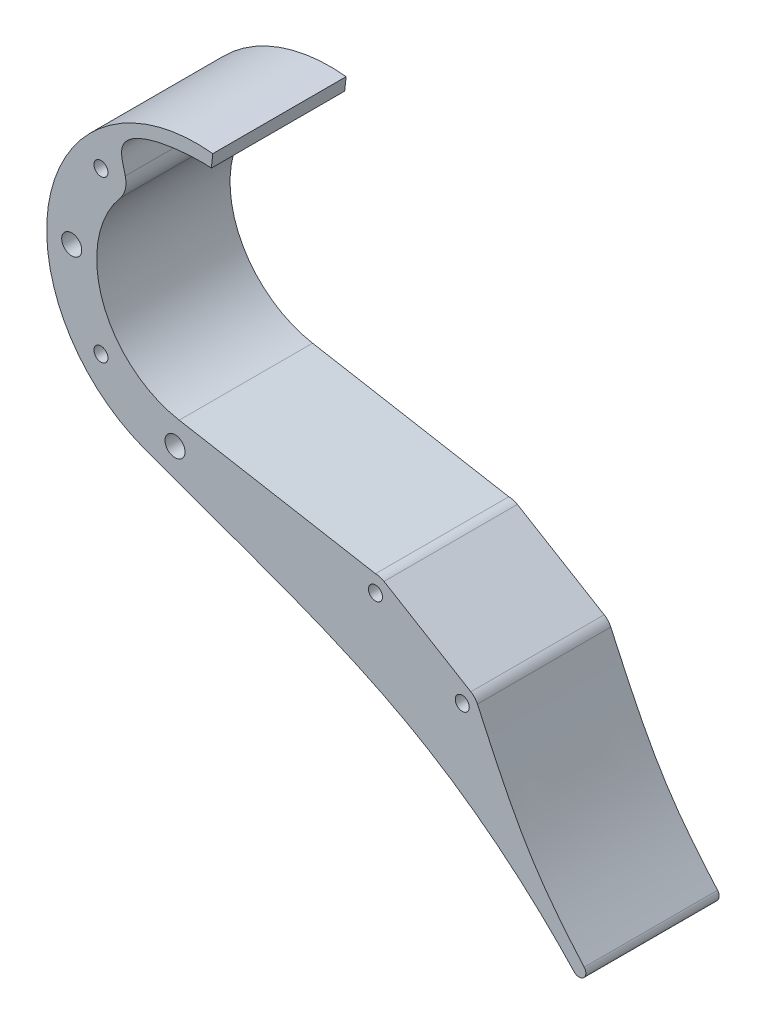
ISO-10303-21;
HEADER;
FILE_DESCRIPTION(('STEP AP214'),'2;1');
FILE_NAME('part.step','',(''),(''),'','','');
FILE_SCHEMA(('AUTOMOTIVE_DESIGN { 1 0 10303 214 1 1 1 1 }'));
ENDSEC;
DATA;
#1=APPLICATION_CONTEXT('core data for automotive mechanical design processes');
#2=APPLICATION_PROTOCOL_DEFINITION('international standard','automotive_design',2000,#1);
#3=PRODUCT_CONTEXT('',#1,'mechanical');
#4=PRODUCT('Part','Part','',(#3));
#5=PRODUCT_RELATED_PRODUCT_CATEGORY('part','',(#4));
#6=PRODUCT_DEFINITION_FORMATION('','',#4);
#7=PRODUCT_DEFINITION_CONTEXT('part definition',#1,'design');
#8=PRODUCT_DEFINITION('design','',#6,#7);
#9=PRODUCT_DEFINITION_SHAPE('','',#8);
#10=(LENGTH_UNIT() NAMED_UNIT(*) SI_UNIT(.MILLI.,.METRE.));
#11=(NAMED_UNIT(*) PLANE_ANGLE_UNIT() SI_UNIT($,.RADIAN.));
#12=(NAMED_UNIT(*) SI_UNIT($,.STERADIAN.) SOLID_ANGLE_UNIT());
#13=UNCERTAINTY_MEASURE_WITH_UNIT(LENGTH_MEASURE(1.E-05),#10,'distance_accuracy_value','');
#14=(GEOMETRIC_REPRESENTATION_CONTEXT(3) GLOBAL_UNCERTAINTY_ASSIGNED_CONTEXT((#13)) GLOBAL_UNIT_ASSIGNED_CONTEXT((#10,
#11,#12)) REPRESENTATION_CONTEXT('',''));
#15=CARTESIAN_POINT('',(0.,0.,0.));
#16=DIRECTION('',(0.,0.,1.));
#17=DIRECTION('',(1.,0.,0.));
#18=AXIS2_PLACEMENT_3D('',#15,#16,#17);
#19=CARTESIAN_POINT('',(-37.49999999528,3.60540814239372E-13,50.0000000000028));
#20=DIRECTION('',(0.,0.,-1.));
#21=DIRECTION('',(-1.,0.,0.));
#22=AXIS2_PLACEMENT_3D('',#19,#20,#21);
#23=CYLINDRICAL_SURFACE('',#22,1.7);
#24=CARTESIAN_POINT('',(-37.49999999528,3.60540814239372E-13,10.));
#25=DIRECTION('',(0.,0.,-1.));
#26=DIRECTION('',(-1.,0.,0.));
#27=AXIS2_PLACEMENT_3D('',#24,#25,#26);
#28=CIRCLE('',#27,1.7);
#29=CARTESIAN_POINT('',(-39.19999999528,3.60540814239372E-13,10.));
#30=VERTEX_POINT('',#29);
#31=EDGE_CURVE('E303',#30,#30,#28,.T.);
#32=ORIENTED_EDGE('',*,*,#31,.T.);
#33=EDGE_LOOP('',(#32));
#34=FACE_BOUND('',#33,.T.);
#35=CARTESIAN_POINT('',(-37.49999999528,3.60540814239372E-13,20.));
#36=DIRECTION('',(0.,0.,1.));
#37=DIRECTION('',(1.,0.,0.));
#38=AXIS2_PLACEMENT_3D('',#35,#36,#37);
#39=CIRCLE('',#38,1.7);
#40=CARTESIAN_POINT('',(-35.79999999528,3.60540814239372E-13,20.));
#41=VERTEX_POINT('',#40);
#42=EDGE_CURVE('E45',#41,#41,#39,.F.);
#43=ORIENTED_EDGE('',*,*,#42,.F.);
#44=EDGE_LOOP('',(#43));
#45=FACE_BOUND('',#44,.T.);
#46=ADVANCED_FACE('F41',(#34,#45),#23,.F.);
#47=CARTESIAN_POINT('',(-6.51180666250987,-36.9302907379578,50.0000000000028));
#48=DIRECTION('',(0.,0.,-1.));
#49=DIRECTION('',(-1.,0.,0.));
#50=AXIS2_PLACEMENT_3D('',#47,#48,#49);
#51=CYLINDRICAL_SURFACE('',#50,1.7);
#52=CARTESIAN_POINT('',(-6.51180666250987,-36.9302907379578,10.));
#53=DIRECTION('',(0.,0.,-1.));
#54=DIRECTION('',(-1.,0.,0.));
#55=AXIS2_PLACEMENT_3D('',#52,#53,#54);
#56=CIRCLE('',#55,1.7);
#57=CARTESIAN_POINT('',(-8.21180666250987,-36.9302907379578,10.));
#58=VERTEX_POINT('',#57);
#59=EDGE_CURVE('E300',#58,#58,#56,.T.);
#60=ORIENTED_EDGE('',*,*,#59,.T.);
#61=EDGE_LOOP('',(#60));
#62=FACE_BOUND('',#61,.T.);
#63=CARTESIAN_POINT('',(-6.51180666250987,-36.9302907379578,20.));
#64=DIRECTION('',(0.,0.,1.));
#65=DIRECTION('',(1.,0.,0.));
#66=AXIS2_PLACEMENT_3D('',#63,#64,#65);
#67=CIRCLE('',#66,1.7);
#68=CARTESIAN_POINT('',(-4.81180666250987,-36.9302907379578,20.));
#69=VERTEX_POINT('',#68);
#70=EDGE_CURVE('E257',#69,#69,#67,.F.);
#71=ORIENTED_EDGE('',*,*,#70,.F.);
#72=EDGE_LOOP('',(#71));
#73=FACE_BOUND('',#72,.T.);
#74=ADVANCED_FACE('F341',(#62,#73),#51,.F.);
#75=CARTESIAN_POINT('',(-28.7266666169616,24.1045353632453,50.0000000000028));
#76=DIRECTION('',(0.,0.,-1.));
#77=DIRECTION('',(-1.,0.,0.));
#78=AXIS2_PLACEMENT_3D('',#75,#76,#77);
#79=CYLINDRICAL_SURFACE('',#78,1.7);
#80=CARTESIAN_POINT('',(-28.7266666169616,24.1045353632453,10.));
#81=DIRECTION('',(0.,0.,-1.));
#82=DIRECTION('',(-1.,0.,0.));
#83=AXIS2_PLACEMENT_3D('',#80,#81,#82);
#84=CIRCLE('',#83,1.7);
#85=CARTESIAN_POINT('',(-30.4266666169616,24.1045353632453,10.));
#86=VERTEX_POINT('',#85);
#87=EDGE_CURVE('E256',#86,#86,#84,.T.);
#88=ORIENTED_EDGE('',*,*,#87,.T.);
#89=EDGE_LOOP('',(#88));
#90=FACE_BOUND('',#89,.T.);
#91=CARTESIAN_POINT('',(-28.7266666169616,24.1045353632453,44.3));
#92=DIRECTION('',(0.,0.,1.));
#93=DIRECTION('',(1.,0.,0.));
#94=AXIS2_PLACEMENT_3D('',#91,#92,#93);
#95=CIRCLE('',#94,1.7);
#96=CARTESIAN_POINT('',(-27.0266666169616,24.1045353632453,44.3));
#97=VERTEX_POINT('',#96);
#98=EDGE_CURVE('E253',#97,#97,#95,.F.);
#99=ORIENTED_EDGE('',*,*,#98,.F.);
#100=EDGE_LOOP('',(#99));
#101=FACE_BOUND('',#100,.T.);
#102=ADVANCED_FACE('F348',(#90,#101),#79,.F.);
#103=CARTESIAN_POINT('',(-28.7266666169617,-24.1045353632452,50.0000000000028));
#104=DIRECTION('',(0.,0.,-1.));
#105=DIRECTION('',(-1.,0.,0.));
#106=AXIS2_PLACEMENT_3D('',#103,#104,#105);
#107=CYLINDRICAL_SURFACE('',#106,1.7);
#108=CARTESIAN_POINT('',(-28.7266666169617,-24.1045353632452,10.));
#109=DIRECTION('',(0.,0.,-1.));
#110=DIRECTION('',(-1.,0.,0.));
#111=AXIS2_PLACEMENT_3D('',#108,#109,#110);
#112=CIRCLE('',#111,1.7);
#113=CARTESIAN_POINT('',(-30.4266666169617,-24.1045353632452,10.));
#114=VERTEX_POINT('',#113);
#115=EDGE_CURVE('E306',#114,#114,#112,.T.);
#116=ORIENTED_EDGE('',*,*,#115,.T.);
#117=EDGE_LOOP('',(#116));
#118=FACE_BOUND('',#117,.T.);
#119=CARTESIAN_POINT('',(-28.7266666169617,-24.1045353632452,44.3));
#120=DIRECTION('',(0.,0.,1.));
#121=DIRECTION('',(1.,0.,0.));
#122=AXIS2_PLACEMENT_3D('',#119,#120,#121);
#123=CIRCLE('',#122,1.7);
#124=CARTESIAN_POINT('',(-27.0266666169617,-24.1045353632452,44.3));
#125=VERTEX_POINT('',#124);
#126=EDGE_CURVE('E250',#125,#125,#123,.F.);
#127=ORIENTED_EDGE('',*,*,#126,.F.);
#128=EDGE_LOOP('',(#127));
#129=FACE_BOUND('',#128,.T.);
#130=ADVANCED_FACE('F354',(#118,#129),#107,.F.);
#131=CARTESIAN_POINT('',(115.928386729515,-113.835015283781,50.));
#132=DIRECTION('',(0.,0.,-1.));
#133=DIRECTION('',(-1.,0.,0.));
#134=AXIS2_PLACEMENT_3D('',#131,#132,#133);
#135=PLANE('',#134);
#136=CARTESIAN_POINT('',(-37.49999999528,3.60822483003176E-13,50.));
#137=DIRECTION('',(0.,0.,1.));
#138=DIRECTION('',(1.,0.,0.));
#139=AXIS2_PLACEMENT_3D('',#136,#137,#138);
#140=CIRCLE('',#139,3.);
#141=CARTESIAN_POINT('',(-34.49999999528,3.60822483003176E-13,50.));
#142=VERTEX_POINT('',#141);
#143=EDGE_CURVE('E265',#142,#142,#140,.T.);
#144=ORIENTED_EDGE('',*,*,#143,.F.);
#145=EDGE_LOOP('',(#144));
#146=FACE_BOUND('',#145,.T.);
#147=CARTESIAN_POINT('',(-6.51180666250987,-36.9302907379578,50.));
#148=DIRECTION('',(0.,0.,1.));
#149=DIRECTION('',(1.,0.,0.));
#150=AXIS2_PLACEMENT_3D('',#147,#148,#149);
#151=CIRCLE('',#150,3.);
#152=CARTESIAN_POINT('',(-3.51180666250987,-36.9302907379578,50.));
#153=VERTEX_POINT('',#152);
#154=EDGE_CURVE('E270',#153,#153,#151,.T.);
#155=ORIENTED_EDGE('',*,*,#154,.F.);
#156=EDGE_LOOP('',(#155));
#157=FACE_BOUND('',#156,.T.);
#158=CARTESIAN_POINT('',(79.6603152634743,-60.6369157836083,50.));
#159=DIRECTION('',(0.,0.,1.));
#160=DIRECTION('',(1.,0.,0.));
#161=AXIS2_PLACEMENT_3D('',#158,#159,#160);
#162=CIRCLE('',#161,2.1);
#163=CARTESIAN_POINT('',(81.7603152634743,-60.6369157836083,50.));
#164=VERTEX_POINT('',#163);
#165=EDGE_CURVE('E284',#164,#164,#162,.T.);
#166=ORIENTED_EDGE('',*,*,#165,.F.);
#167=EDGE_LOOP('',(#166));
#168=FACE_BOUND('',#167,.T.);
#169=CARTESIAN_POINT('',(-28.7266666169616,24.1045353632453,50.));
#170=DIRECTION('',(0.,0.,1.));
#171=DIRECTION('',(1.,0.,0.));
#172=AXIS2_PLACEMENT_3D('',#169,#170,#171);
#173=CIRCLE('',#172,2.1);
#174=CARTESIAN_POINT('',(-26.6266666169616,24.1045353632453,50.));
#175=VERTEX_POINT('',#174);
#176=EDGE_CURVE('E291',#175,#175,#173,.T.);
#177=ORIENTED_EDGE('',*,*,#176,.F.);
#178=EDGE_LOOP('',(#177));
#179=FACE_BOUND('',#178,.T.);
#180=CARTESIAN_POINT('',(-28.7266666169617,-24.1045353632452,50.));
#181=DIRECTION('',(0.,0.,1.));
#182=DIRECTION('',(1.,0.,0.));
#183=AXIS2_PLACEMENT_3D('',#180,#181,#182);
#184=CIRCLE('',#183,2.1);
#185=CARTESIAN_POINT('',(-26.6266666169617,-24.1045353632452,50.));
#186=VERTEX_POINT('',#185);
#187=EDGE_CURVE('E278',#186,#186,#184,.T.);
#188=ORIENTED_EDGE('',*,*,#187,.F.);
#189=EDGE_LOOP('',(#188));
#190=FACE_BOUND('',#189,.T.);
#191=CARTESIAN_POINT('',(53.6231110183284,-44.9951326780578,50.));
#192=DIRECTION('',(0.,0.,1.));
#193=DIRECTION('',(1.,0.,0.));
#194=AXIS2_PLACEMENT_3D('',#191,#192,#193);
#195=CIRCLE('',#194,2.1);
#196=CARTESIAN_POINT('',(55.7231110183284,-44.9951326780578,50.));
#197=VERTEX_POINT('',#196);
#198=EDGE_CURVE('E287',#197,#197,#195,.T.);
#199=ORIENTED_EDGE('',*,*,#198,.F.);
#200=EDGE_LOOP('',(#199));
#201=FACE_BOUND('',#200,.T.);
#202=CARTESIAN_POINT('',(-16.0507830675253,-42.0401280078837,50.));
#203=CARTESIAN_POINT('',(9.97018077922429,-51.9748467088775,50.));
#204=CARTESIAN_POINT('',(77.4499130372151,-71.8000648801267,50.));
#205=CARTESIAN_POINT('',(124.366937183275,-122.097173087462,50.));
#206=CARTESIAN_POINT('',(145.104854327502,-155.818931874102,50.));
#207=B_SPLINE_CURVE_WITH_KNOTS('',3,(#202,#203,#204,#205,#206),.UNSPECIFIED.,.F.,.F.,(4,1,4),
(0.,0.431450870273525,1.),.UNSPECIFIED.);
#208=CARTESIAN_POINT('',(113.235878653208,-113.622698723009,50.));
#209=VERTEX_POINT('',#208);
#210=CARTESIAN_POINT('',(-16.0507830675253,-42.0401280078837,50.));
#211=VERTEX_POINT('',#210);
#212=EDGE_CURVE('E241',#209,#211,#207,.F.);
#213=ORIENTED_EDGE('',*,*,#212,.F.);
#214=CARTESIAN_POINT('',(114.697571373205,-112.257614699108,50.));
#215=DIRECTION('',(0.,0.,1.));
#216=DIRECTION('',(1.,0.,0.));
#217=AXIS2_PLACEMENT_3D('',#214,#215,#216);
#218=CIRCLE('',#217,2.);
#219=CARTESIAN_POINT('',(115.88356165462,-113.868026774444,50.));
#220=VERTEX_POINT('',#219);
#221=EDGE_CURVE('E238',#209,#220,#218,.T.);
#222=ORIENTED_EDGE('',*,*,#221,.T.);
#223=DIRECTION('',(-0.805206037668046,-0.592995140707684,0.));
#224=VECTOR('',#223,1.);
#225=CARTESIAN_POINT('',(95.1197482241385,-129.159566940357,50.));
#226=LINE('',#225,#224);
#227=CARTESIAN_POINT('',(115.928386729515,-113.835015283781,50.));
#228=VERTEX_POINT('',#227);
#229=EDGE_CURVE('E416',#228,#220,#226,.T.);
#230=ORIENTED_EDGE('',*,*,#229,.F.);
#231=CARTESIAN_POINT('',(114.742396448099,-112.224603208445,50.));
#232=DIRECTION('',(0.,0.,1.));
#233=DIRECTION('',(1.,0.,0.));
#234=AXIS2_PLACEMENT_3D('',#231,#232,#233);
#235=CIRCLE('',#234,2.);
#236=CARTESIAN_POINT('',(116.247554202597,-110.907598981392,50.));
#237=VERTEX_POINT('',#236);
#238=EDGE_CURVE('E235',#228,#237,#235,.T.);
#239=ORIENTED_EDGE('',*,*,#238,.T.);
#240=CARTESIAN_POINT('',(84.2111416414532,-58.5656892683541,50.));
#241=CARTESIAN_POINT('',(96.8226089399577,-86.2751636422905,50.));
#242=CARTESIAN_POINT('',(101.985979575103,-94.7812522554878,50.));
#243=CARTESIAN_POINT('',(117.684756324547,-112.541534377755,50.));
#244=B_SPLINE_CURVE_WITH_KNOTS('',3,(#240,#241,#242,#243),.UNSPECIFIED.,.F.,.F.,(4,4),(0.,1.),.UNSPECIFIED.);
#245=CARTESIAN_POINT('',(84.2111416414532,-58.5656892683541,50.));
#246=VERTEX_POINT('',#245);
#247=EDGE_CURVE('E474',#246,#237,#244,.T.);
#248=ORIENTED_EDGE('',*,*,#247,.F.);
#249=CARTESIAN_POINT('',(79.6603152634744,-60.6369157836083,50.));
#250=DIRECTION('',(0.,0.,-1.));
#251=DIRECTION('',(-1.,0.,0.));
#252=AXIS2_PLACEMENT_3D('',#249,#250,#251);
#253=CIRCLE('',#252,5.00000000000001);
#254=CARTESIAN_POINT('',(82.2351491319743,-56.3508650898314,50.));
#255=VERTEX_POINT('',#254);
#256=EDGE_CURVE('E314',#255,#246,#253,.T.);
#257=ORIENTED_EDGE('',*,*,#256,.F.);
#258=DIRECTION('',(-0.857210138755384,0.514966773699989,0.));
#259=VECTOR('',#258,1.);
#260=CARTESIAN_POINT('',(-3.06722627517245,-5.10568369691846,50.));
#261=LINE('',#260,#259);
#262=CARTESIAN_POINT('',(56.1979448868283,-40.7090819842809,50.));
#263=VERTEX_POINT('',#262);
#264=EDGE_CURVE('E11',#255,#263,#261,.T.);
#265=ORIENTED_EDGE('',*,*,#264,.T.);
#266=CARTESIAN_POINT('',(53.6231110183284,-44.9951326780578,50.));
#267=DIRECTION('',(0.,0.,-1.));
#268=DIRECTION('',(-1.,0.,0.));
#269=AXIS2_PLACEMENT_3D('',#266,#267,#268);
#270=CIRCLE('',#269,5.);
#271=CARTESIAN_POINT('',(53.6231110183284,-39.9951326780579,50.));
#272=VERTEX_POINT('',#271);
#273=EDGE_CURVE('E58',#272,#263,#270,.T.);
#274=ORIENTED_EDGE('',*,*,#273,.F.);
#275=DIRECTION('',(-0.984586279406956,0.174899566619156,0.));
#276=VECTOR('',#275,1.);
#277=CARTESIAN_POINT('',(-5.24698699857468,-29.5375883822087,50.));
#278=LINE('',#277,#276);
#279=CARTESIAN_POINT('',(-5.24698699857468,-29.5375883822087,50.));
#280=VERTEX_POINT('',#279);
#281=EDGE_CURVE('E65',#272,#280,#278,.T.);
#282=ORIENTED_EDGE('',*,*,#281,.T.);
#283=CARTESIAN_POINT('',(0.,0.,50.));
#284=DIRECTION('',(0.,0.,-1.));
#285=DIRECTION('',(-1.,0.,0.));
#286=AXIS2_PLACEMENT_3D('',#283,#284,#285);
#287=CIRCLE('',#286,30.);
#288=CARTESIAN_POINT('',(-22.9813332935693,19.2836282905962,50.));
#289=VERTEX_POINT('',#288);
#290=EDGE_CURVE('E50',#280,#289,#287,.T.);
#291=ORIENTED_EDGE('',*,*,#290,.T.);
#292=CARTESIAN_POINT('',(-28.7266666169616,24.1045353632453,50.));
#293=DIRECTION('',(0.,0.,-1.));
#294=DIRECTION('',(-1.,0.,0.));
#295=AXIS2_PLACEMENT_3D('',#292,#293,#294);
#296=CIRCLE('',#295,7.49999999999998);
#297=CARTESIAN_POINT('',(-21.4217090009833,25.8038276361517,50.));
#298=VERTEX_POINT('',#297);
#299=EDGE_CURVE('E170',#298,#289,#296,.T.);
#300=ORIENTED_EDGE('',*,*,#299,.F.);
#301=CARTESIAN_POINT('',(4.39443125726207,40.7638194226841,50.));
#302=CARTESIAN_POINT('',(1.06403648503507,41.2904884940722,50.));
#303=CARTESIAN_POINT('',(-26.4924805149912,40.5698715353632,50.));
#304=CARTESIAN_POINT('',(-21.8839998126264,27.7911342573566,50.));
#305=CARTESIAN_POINT('',(-21.4217090009833,25.8038276361517,50.));
#306=B_SPLINE_CURVE_WITH_KNOTS('',3,(#301,#302,#303,#304,#305),.UNSPECIFIED.,.F.,.F.,(4,1,4),
(0.,0.815920259472726,1.),.UNSPECIFIED.);
#307=CARTESIAN_POINT('',(4.39443125726207,40.7638194226841,50.));
#308=VERTEX_POINT('',#307);
#309=EDGE_CURVE('E460',#308,#298,#306,.T.);
#310=ORIENTED_EDGE('',*,*,#309,.F.);
#311=DIRECTION('',(-0.107181250177123,-0.994239498114247,0.));
#312=VECTOR('',#311,1.);
#313=CARTESIAN_POINT('',(0.,0.,50.));
#314=LINE('',#313,#312);
#315=CARTESIAN_POINT('',(4.82315625797057,44.7407774151411,50.));
#316=VERTEX_POINT('',#315);
#317=EDGE_CURVE('E452',#316,#308,#314,.T.);
#318=ORIENTED_EDGE('',*,*,#317,.F.);
#319=CARTESIAN_POINT('',(0.,0.,50.));
#320=DIRECTION('',(0.,0.,-1.));
#321=DIRECTION('',(-1.,0.,0.));
#322=AXIS2_PLACEMENT_3D('',#319,#320,#321);
#323=CIRCLE('',#322,45.);
#324=EDGE_CURVE('E234',#211,#316,#323,.T.);
#325=ORIENTED_EDGE('',*,*,#324,.F.);
#326=EDGE_LOOP('',(#213,#222,#230,#239,#248,#257,#265,#274,#282,#291,#300,#310,#318,#325));
#327=FACE_BOUND('',#326,.T.);
#328=ADVANCED_FACE('F43',(#146,#157,#168,#179,#190,#201,#327),#135,.F.);
#329=CARTESIAN_POINT('',(53.6231110183284,-44.9951326780578,15.7));
#330=DIRECTION('',(0.,0.,-1.));
#331=DIRECTION('',(-1.,0.,0.));
#332=AXIS2_PLACEMENT_3D('',#329,#330,#331);
#333=PLANE('',#332);
#334=CARTESIAN_POINT('',(53.6231110183284,-44.9951326780578,15.7));
#335=DIRECTION('',(0.,0.,-1.));
#336=DIRECTION('',(-1.,0.,0.));
#337=AXIS2_PLACEMENT_3D('',#334,#335,#336);
#338=CIRCLE('',#337,2.1);
#339=CARTESIAN_POINT('',(51.5231110183284,-44.9951326780578,15.7));
#340=VERTEX_POINT('',#339);
#341=EDGE_CURVE('E173',#340,#340,#338,.T.);
#342=ORIENTED_EDGE('',*,*,#341,.T.);
#343=EDGE_LOOP('',(#342));
#344=FACE_BOUND('',#343,.T.);
#345=ADVANCED_FACE('F324',(#344),#333,.T.);
#346=CARTESIAN_POINT('',(79.6603152634744,-60.6369157836083,15.7));
#347=DIRECTION('',(0.,0.,-1.));
#348=DIRECTION('',(-1.,0.,0.));
#349=AXIS2_PLACEMENT_3D('',#346,#347,#348);
#350=PLANE('',#349);
#351=CARTESIAN_POINT('',(79.6603152634744,-60.6369157836083,15.7));
#352=DIRECTION('',(0.,0.,-1.));
#353=DIRECTION('',(-1.,0.,0.));
#354=AXIS2_PLACEMENT_3D('',#351,#352,#353);
#355=CIRCLE('',#354,2.1);
#356=CARTESIAN_POINT('',(77.5603152634744,-60.6369157836083,15.7));
#357=VERTEX_POINT('',#356);
#358=EDGE_CURVE('E311',#357,#357,#355,.T.);
#359=ORIENTED_EDGE('',*,*,#358,.T.);
#360=EDGE_LOOP('',(#359));
#361=FACE_BOUND('',#360,.T.);
#362=ADVANCED_FACE('F328',(#361),#350,.T.);
#363=CARTESIAN_POINT('',(53.6231110183284,-44.9951326780578,15.7));
#364=DIRECTION('',(0.,0.,-1.));
#365=DIRECTION('',(-1.,0.,0.));
#366=AXIS2_PLACEMENT_3D('',#363,#364,#365);
#367=CYLINDRICAL_SURFACE('',#366,2.1);
#368=ORIENTED_EDGE('',*,*,#341,.F.);
#369=EDGE_LOOP('',(#368));
#370=FACE_BOUND('',#369,.T.);
#371=CARTESIAN_POINT('',(53.6231110183284,-44.9951326780578,10.));
#372=DIRECTION('',(0.,0.,-1.));
#373=DIRECTION('',(-1.,0.,0.));
#374=AXIS2_PLACEMENT_3D('',#371,#372,#373);
#375=CIRCLE('',#374,2.1);
#376=CARTESIAN_POINT('',(51.5231110183284,-44.9951326780578,10.));
#377=VERTEX_POINT('',#376);
#378=EDGE_CURVE('E317',#377,#377,#375,.T.);
#379=ORIENTED_EDGE('',*,*,#378,.T.);
#380=EDGE_LOOP('',(#379));
#381=FACE_BOUND('',#380,.T.);
#382=ADVANCED_FACE('F326',(#370,#381),#367,.F.);
#383=CARTESIAN_POINT('',(79.6603152634744,-60.6369157836083,15.7));
#384=DIRECTION('',(0.,0.,-1.));
#385=DIRECTION('',(-1.,0.,0.));
#386=AXIS2_PLACEMENT_3D('',#383,#384,#385);
#387=CYLINDRICAL_SURFACE('',#386,2.1);
#388=ORIENTED_EDGE('',*,*,#358,.F.);
#389=EDGE_LOOP('',(#388));
#390=FACE_BOUND('',#389,.T.);
#391=CARTESIAN_POINT('',(79.6603152634744,-60.6369157836083,10.));
#392=DIRECTION('',(0.,0.,-1.));
#393=DIRECTION('',(-1.,0.,0.));
#394=AXIS2_PLACEMENT_3D('',#391,#392,#393);
#395=CIRCLE('',#394,2.1);
#396=CARTESIAN_POINT('',(77.5603152634744,-60.6369157836083,10.));
#397=VERTEX_POINT('',#396);
#398=EDGE_CURVE('E315',#397,#397,#395,.T.);
#399=ORIENTED_EDGE('',*,*,#398,.T.);
#400=EDGE_LOOP('',(#399));
#401=FACE_BOUND('',#400,.T.);
#402=ADVANCED_FACE('F198',(#390,#401),#387,.F.);
#403=CARTESIAN_POINT('',(79.6603152634744,-60.6369157836083,10.));
#404=DIRECTION('',(0.,0.,1.));
#405=DIRECTION('',(1.,0.,0.));
#406=AXIS2_PLACEMENT_3D('',#403,#404,#405);
#407=CYLINDRICAL_SURFACE('',#406,5.00000000000001);
#408=ORIENTED_EDGE('',*,*,#256,.T.);
#409=DIRECTION('',(0.,0.,1.));
#410=VECTOR('',#409,1.);
#411=CARTESIAN_POINT('',(84.2111416414532,-58.5656892683541,10.));
#412=LINE('',#411,#410);
#413=CARTESIAN_POINT('',(84.2111416414532,-58.5656892683541,10.));
#414=VERTEX_POINT('',#413);
#415=EDGE_CURVE('E154',#414,#246,#412,.T.);
#416=ORIENTED_EDGE('',*,*,#415,.F.);
#417=CARTESIAN_POINT('',(79.6603152634744,-60.6369157836083,10.));
#418=DIRECTION('',(0.,0.,-1.));
#419=DIRECTION('',(-1.,0.,0.));
#420=AXIS2_PLACEMENT_3D('',#417,#418,#419);
#421=CIRCLE('',#420,5.00000000000001);
#422=CARTESIAN_POINT('',(82.2351491319743,-56.3508650898314,10.));
#423=VERTEX_POINT('',#422);
#424=EDGE_CURVE('E157',#423,#414,#421,.T.);
#425=ORIENTED_EDGE('',*,*,#424,.F.);
#426=DIRECTION('',(0.,0.,1.));
#427=VECTOR('',#426,1.);
#428=CARTESIAN_POINT('',(82.2351491319743,-56.3508650898314,10.));
#429=LINE('',#428,#427);
#430=EDGE_CURVE('E145',#423,#255,#429,.T.);
#431=ORIENTED_EDGE('',*,*,#430,.T.);
#432=EDGE_LOOP('',(#408,#416,#425,#431));
#433=FACE_BOUND('',#432,.T.);
#434=ADVANCED_FACE('F158',(#433),#407,.T.);
#435=CARTESIAN_POINT('',(0.,0.,60.));
#436=DIRECTION('',(0.,0.,-1.));
#437=DIRECTION('',(-1.,0.,0.));
#438=AXIS2_PLACEMENT_3D('',#435,#436,#437);
#439=CYLINDRICAL_SURFACE('',#438,45.);
#440=DIRECTION('',(0.,0.,-1.));
#441=VECTOR('',#440,1.);
#442=CARTESIAN_POINT('',(-16.0507830675253,-42.0401280078837,60.));
#443=LINE('',#442,#441);
#444=CARTESIAN_POINT('',(-16.0507830675253,-42.0401280078837,10.));
#445=VERTEX_POINT('',#444);
#446=EDGE_CURVE('E153',#211,#445,#443,.T.);
#447=ORIENTED_EDGE('',*,*,#446,.F.);
#448=ORIENTED_EDGE('',*,*,#324,.T.);
#449=DIRECTION('',(0.,0.,1.));
#450=VECTOR('',#449,1.);
#451=CARTESIAN_POINT('',(4.82315625797056,44.7407774151411,10.));
#452=LINE('',#451,#450);
#453=CARTESIAN_POINT('',(4.82315625797056,44.7407774151411,10.));
#454=VERTEX_POINT('',#453);
#455=EDGE_CURVE('E459',#454,#316,#452,.T.);
#456=ORIENTED_EDGE('',*,*,#455,.F.);
#457=CARTESIAN_POINT('',(0.,0.,10.));
#458=DIRECTION('',(0.,0.,-1.));
#459=DIRECTION('',(-1.,0.,0.));
#460=AXIS2_PLACEMENT_3D('',#457,#458,#459);
#461=CIRCLE('',#460,45.);
#462=EDGE_CURVE('E418',#445,#454,#461,.T.);
#463=ORIENTED_EDGE('',*,*,#462,.F.);
#464=EDGE_LOOP('',(#447,#448,#456,#463));
#465=FACE_BOUND('',#464,.T.);
#466=ADVANCED_FACE('F197',(#465),#439,.T.);
#467=CARTESIAN_POINT('',(0.,0.,10.));
#468=DIRECTION('',(-0.994239498114247,0.107181250177123,0.));
#469=DIRECTION('',(-0.107181250177123,-0.994239498114247,0.));
#470=AXIS2_PLACEMENT_3D('',#467,#468,#469);
#471=PLANE('',#470);
#472=ORIENTED_EDGE('',*,*,#317,.T.);
#473=DIRECTION('',(0.,0.,1.));
#474=VECTOR('',#473,1.);
#475=CARTESIAN_POINT('',(4.39443125726207,40.7638194226841,10.));
#476=LINE('',#475,#474);
#477=CARTESIAN_POINT('',(4.39443125726207,40.7638194226841,10.));
#478=VERTEX_POINT('',#477);
#479=EDGE_CURVE('E456',#478,#308,#476,.T.);
#480=ORIENTED_EDGE('',*,*,#479,.F.);
#481=DIRECTION('',(-0.107181250177123,-0.994239498114247,0.));
#482=VECTOR('',#481,1.);
#483=CARTESIAN_POINT('',(0.,0.,10.));
#484=LINE('',#483,#482);
#485=EDGE_CURVE('E420',#454,#478,#484,.T.);
#486=ORIENTED_EDGE('',*,*,#485,.F.);
#487=ORIENTED_EDGE('',*,*,#455,.T.);
#488=EDGE_LOOP('',(#472,#480,#486,#487));
#489=FACE_BOUND('',#488,.T.);
#490=ADVANCED_FACE('F205',(#489),#471,.F.);
#491=CARTESIAN_POINT('',(4.39443125726207,40.7638194226841,10.));
#492=CARTESIAN_POINT('',(1.06403648503507,41.2904884940722,10.));
#493=CARTESIAN_POINT('',(-26.4924805149912,40.5698715353632,10.));
#494=CARTESIAN_POINT('',(-21.8839998126264,27.7911342573566,10.));
#495=CARTESIAN_POINT('',(-21.4217090009833,25.8038276361517,10.));
#496=B_SPLINE_CURVE_WITH_KNOTS('',3,(#491,#492,#493,#494,#495),.UNSPECIFIED.,.F.,.F.,(4,1,4),
(0.,0.815920259472726,1.),.UNSPECIFIED.);
#497=DIRECTION('',(0.,0.,1.));
#498=VECTOR('',#497,1.);
#499=SURFACE_OF_LINEAR_EXTRUSION('',#496,#498);
#500=ORIENTED_EDGE('',*,*,#309,.T.);
#501=DIRECTION('',(0.,0.,1.));
#502=VECTOR('',#501,1.);
#503=CARTESIAN_POINT('',(-21.4217090009833,25.8038276361517,10.));
#504=LINE('',#503,#502);
#505=CARTESIAN_POINT('',(-21.4217090009833,25.8038276361517,10.));
#506=VERTEX_POINT('',#505);
#507=EDGE_CURVE('E467',#506,#298,#504,.T.);
#508=ORIENTED_EDGE('',*,*,#507,.F.);
#509=EDGE_CURVE('E429',#478,#506,#496,.T.);
#510=ORIENTED_EDGE('',*,*,#509,.F.);
#511=ORIENTED_EDGE('',*,*,#479,.T.);
#512=EDGE_LOOP('',(#500,#508,#510,#511));
#513=FACE_BOUND('',#512,.T.);
#514=ADVANCED_FACE('F440',(#513),#499,.F.);
#515=CARTESIAN_POINT('',(-28.7266666169616,24.1045353632453,10.));
#516=DIRECTION('',(0.,0.,1.));
#517=DIRECTION('',(1.,0.,0.));
#518=AXIS2_PLACEMENT_3D('',#515,#516,#517);
#519=CYLINDRICAL_SURFACE('',#518,7.49999999999998);
#520=ORIENTED_EDGE('',*,*,#299,.T.);
#521=DIRECTION('',(0.,0.,1.));
#522=VECTOR('',#521,1.);
#523=CARTESIAN_POINT('',(-22.9813332935693,19.2836282905962,10.));
#524=LINE('',#523,#522);
#525=CARTESIAN_POINT('',(-22.9813332935693,19.2836282905962,10.));
#526=VERTEX_POINT('',#525);
#527=EDGE_CURVE('E470',#526,#289,#524,.T.);
#528=ORIENTED_EDGE('',*,*,#527,.F.);
#529=CARTESIAN_POINT('',(-28.7266666169616,24.1045353632453,10.));
#530=DIRECTION('',(0.,0.,-1.));
#531=DIRECTION('',(-1.,0.,0.));
#532=AXIS2_PLACEMENT_3D('',#529,#530,#531);
#533=CIRCLE('',#532,7.49999999999998);
#534=EDGE_CURVE('E434',#506,#526,#533,.T.);
#535=ORIENTED_EDGE('',*,*,#534,.F.);
#536=ORIENTED_EDGE('',*,*,#507,.T.);
#537=EDGE_LOOP('',(#520,#528,#535,#536));
#538=FACE_BOUND('',#537,.T.);
#539=ADVANCED_FACE('F443',(#538),#519,.T.);
#540=CARTESIAN_POINT('',(0.,0.,10.));
#541=DIRECTION('',(0.,0.,1.));
#542=DIRECTION('',(1.,0.,0.));
#543=AXIS2_PLACEMENT_3D('',#540,#541,#542);
#544=CYLINDRICAL_SURFACE('',#543,30.);
#545=ORIENTED_EDGE('',*,*,#290,.F.);
#546=DIRECTION('',(0.,0.,1.));
#547=VECTOR('',#546,1.);
#548=CARTESIAN_POINT('',(-5.24698699857468,-29.5375883822087,10.));
#549=LINE('',#548,#547);
#550=CARTESIAN_POINT('',(-5.24698699857468,-29.5375883822087,10.));
#551=VERTEX_POINT('',#550);
#552=EDGE_CURVE('E495',#551,#280,#549,.T.);
#553=ORIENTED_EDGE('',*,*,#552,.F.);
#554=CARTESIAN_POINT('',(0.,0.,10.));
#555=DIRECTION('',(0.,0.,-1.));
#556=DIRECTION('',(-1.,0.,0.));
#557=AXIS2_PLACEMENT_3D('',#554,#555,#556);
#558=CIRCLE('',#557,30.);
#559=EDGE_CURVE('E502',#551,#526,#558,.T.);
#560=ORIENTED_EDGE('',*,*,#559,.T.);
#561=ORIENTED_EDGE('',*,*,#527,.T.);
#562=EDGE_LOOP('',(#545,#553,#560,#561));
#563=FACE_BOUND('',#562,.T.);
#564=ADVANCED_FACE('F500',(#563),#544,.F.);
#565=CARTESIAN_POINT('',(-5.24698699857468,-29.5375883822087,10.));
#566=DIRECTION('',(0.174899566619156,0.984586279406955,0.));
#567=DIRECTION('',(-0.984586279406956,0.174899566619156,0.));
#568=AXIS2_PLACEMENT_3D('',#565,#566,#567);
#569=PLANE('',#568);
#570=ORIENTED_EDGE('',*,*,#281,.F.);
#571=DIRECTION('',(0.,0.,1.));
#572=VECTOR('',#571,1.);
#573=CARTESIAN_POINT('',(53.6231110183284,-39.9951326780578,10.));
#574=LINE('',#573,#572);
#575=CARTESIAN_POINT('',(53.6231110183284,-39.9951326780578,10.));
#576=VERTEX_POINT('',#575);
#577=EDGE_CURVE('E493',#576,#272,#574,.T.);
#578=ORIENTED_EDGE('',*,*,#577,.F.);
#579=DIRECTION('',(-0.984586279406956,0.174899566619156,0.));
#580=VECTOR('',#579,1.);
#581=CARTESIAN_POINT('',(-5.24698699857468,-29.5375883822087,10.));
#582=LINE('',#581,#580);
#583=EDGE_CURVE('E506',#576,#551,#582,.T.);
#584=ORIENTED_EDGE('',*,*,#583,.T.);
#585=ORIENTED_EDGE('',*,*,#552,.T.);
#586=EDGE_LOOP('',(#570,#578,#584,#585));
#587=FACE_BOUND('',#586,.T.);
#588=ADVANCED_FACE('F191',(#587),#569,.T.);
#589=CARTESIAN_POINT('',(84.2111416414532,-58.5656892683541,10.));
#590=CARTESIAN_POINT('',(96.8226089399577,-86.2751636422905,10.));
#591=CARTESIAN_POINT('',(101.985979575103,-94.7812522554878,10.));
#592=CARTESIAN_POINT('',(117.684756324547,-112.541534377755,10.));
#593=B_SPLINE_CURVE_WITH_KNOTS('',3,(#589,#590,#591,#592),.UNSPECIFIED.,.F.,.F.,(4,4),(0.,1.),.UNSPECIFIED.);
#594=DIRECTION('',(0.,0.,1.));
#595=VECTOR('',#594,1.);
#596=SURFACE_OF_LINEAR_EXTRUSION('',#593,#595);
#597=ORIENTED_EDGE('',*,*,#247,.T.);
#598=DIRECTION('',(0.,0.,1.));
#599=VECTOR('',#598,1.);
#600=CARTESIAN_POINT('',(116.247554202597,-110.907598981392,50.));
#601=LINE('',#600,#599);
#602=CARTESIAN_POINT('',(116.247554202597,-110.907598981392,10.));
#603=VERTEX_POINT('',#602);
#604=EDGE_CURVE('E225',#237,#603,#601,.F.);
#605=ORIENTED_EDGE('',*,*,#604,.T.);
#606=EDGE_CURVE('E163',#414,#603,#593,.T.);
#607=ORIENTED_EDGE('',*,*,#606,.F.);
#608=ORIENTED_EDGE('',*,*,#415,.T.);
#609=EDGE_LOOP('',(#597,#605,#607,#608));
#610=FACE_BOUND('',#609,.T.);
#611=ADVANCED_FACE('F186',(#610),#596,.F.);
#612=CARTESIAN_POINT('',(-16.0507830675253,-42.0401280078837,60.));
#613=CARTESIAN_POINT('',(9.97018077922429,-51.9748467088775,60.));
#614=CARTESIAN_POINT('',(77.4499130372151,-71.8000648801267,60.));
#615=CARTESIAN_POINT('',(124.366937183275,-122.097173087462,60.));
#616=CARTESIAN_POINT('',(145.104854327502,-155.818931874102,60.));
#617=B_SPLINE_CURVE_WITH_KNOTS('',3,(#612,#613,#614,#615,#616),.UNSPECIFIED.,.F.,.F.,(4,1,4),
(0.,0.431450870273525,1.),.UNSPECIFIED.);
#618=DIRECTION('',(0.,0.,-1.));
#619=VECTOR('',#618,1.);
#620=SURFACE_OF_LINEAR_EXTRUSION('',#617,#619);
#621=DIRECTION('',(0.,0.,-1.));
#622=VECTOR('',#621,1.);
#623=CARTESIAN_POINT('',(113.235878653208,-113.622698723009,10.));
#624=LINE('',#623,#622);
#625=CARTESIAN_POINT('',(113.235878653208,-113.622698723009,10.));
#626=VERTEX_POINT('',#625);
#627=EDGE_CURVE('E231',#626,#209,#624,.F.);
#628=ORIENTED_EDGE('',*,*,#627,.T.);
#629=ORIENTED_EDGE('',*,*,#212,.T.);
#630=ORIENTED_EDGE('',*,*,#446,.T.);
#631=CARTESIAN_POINT('',(145.104854327502,-155.818931874102,10.));
#632=CARTESIAN_POINT('',(124.366937183275,-122.097173087462,10.));
#633=CARTESIAN_POINT('',(77.4499130372151,-71.8000648801267,10.));
#634=CARTESIAN_POINT('',(9.97018077922429,-51.9748467088775,10.));
#635=CARTESIAN_POINT('',(-16.0507830675253,-42.0401280078837,10.));
#636=B_SPLINE_CURVE_WITH_KNOTS('',3,(#631,#632,#633,#634,#635),.UNSPECIFIED.,.F.,.F.,(4,1,4),
(0.,0.568549129726475,1.),.UNSPECIFIED.);
#637=EDGE_CURVE('E408',#626,#445,#636,.T.);
#638=ORIENTED_EDGE('',*,*,#637,.F.);
#639=EDGE_LOOP('',(#628,#629,#630,#638));
#640=FACE_BOUND('',#639,.T.);
#641=ADVANCED_FACE('F190',(#640),#620,.F.);
#642=CARTESIAN_POINT('',(95.1197482241385,-129.159566940357,10.));
#643=DIRECTION('',(-0.592995140707684,0.805206037668046,0.));
#644=DIRECTION('',(-0.805206037668046,-0.592995140707684,0.));
#645=AXIS2_PLACEMENT_3D('',#642,#643,#644);
#646=PLANE('',#645);
#647=DIRECTION('',(-0.805206037668046,-0.592995140707684,0.));
#648=VECTOR('',#647,1.);
#649=CARTESIAN_POINT('',(95.1197482241385,-129.159566940357,10.));
#650=LINE('',#649,#648);
#651=CARTESIAN_POINT('',(115.928386729515,-113.835015283781,10.));
#652=VERTEX_POINT('',#651);
#653=CARTESIAN_POINT('',(115.88356165462,-113.868026774444,10.));
#654=VERTEX_POINT('',#653);
#655=EDGE_CURVE('E180',#652,#654,#650,.T.);
#656=ORIENTED_EDGE('',*,*,#655,.F.);
#657=DIRECTION('',(0.,0.,1.));
#658=VECTOR('',#657,1.);
#659=CARTESIAN_POINT('',(115.928386729515,-113.835015283781,10.));
#660=LINE('',#659,#658);
#661=EDGE_CURVE('E222',#652,#228,#660,.T.);
#662=ORIENTED_EDGE('',*,*,#661,.T.);
#663=ORIENTED_EDGE('',*,*,#229,.T.);
#664=DIRECTION('',(0.,0.,-1.));
#665=VECTOR('',#664,1.);
#666=CARTESIAN_POINT('',(115.88356165462,-113.868026774444,10.));
#667=LINE('',#666,#665);
#668=EDGE_CURVE('E220',#220,#654,#667,.T.);
#669=ORIENTED_EDGE('',*,*,#668,.T.);
#670=EDGE_LOOP('',(#656,#662,#663,#669));
#671=FACE_BOUND('',#670,.T.);
#672=ADVANCED_FACE('F193',(#671),#646,.F.);
#673=CARTESIAN_POINT('',(0.,0.,10.));
#674=DIRECTION('',(0.,0.,-1.));
#675=DIRECTION('',(-1.,0.,0.));
#676=AXIS2_PLACEMENT_3D('',#673,#674,#675);
#677=PLANE('',#676);
#678=ORIENTED_EDGE('',*,*,#59,.F.);
#679=EDGE_LOOP('',(#678));
#680=FACE_BOUND('',#679,.T.);
#681=ORIENTED_EDGE('',*,*,#31,.F.);
#682=EDGE_LOOP('',(#681));
#683=FACE_BOUND('',#682,.T.);
#684=ORIENTED_EDGE('',*,*,#115,.F.);
#685=EDGE_LOOP('',(#684));
#686=FACE_BOUND('',#685,.T.);
#687=ORIENTED_EDGE('',*,*,#87,.F.);
#688=EDGE_LOOP('',(#687));
#689=FACE_BOUND('',#688,.T.);
#690=ORIENTED_EDGE('',*,*,#398,.F.);
#691=EDGE_LOOP('',(#690));
#692=FACE_BOUND('',#691,.T.);
#693=ORIENTED_EDGE('',*,*,#378,.F.);
#694=EDGE_LOOP('',(#693));
#695=FACE_BOUND('',#694,.T.);
#696=ORIENTED_EDGE('',*,*,#606,.T.);
#697=CARTESIAN_POINT('',(114.742396448099,-112.224603208445,10.));
#698=DIRECTION('',(0.,0.,-1.));
#699=DIRECTION('',(-1.,0.,0.));
#700=AXIS2_PLACEMENT_3D('',#697,#698,#699);
#701=CIRCLE('',#700,2.);
#702=EDGE_CURVE('E229',#603,#652,#701,.T.);
#703=ORIENTED_EDGE('',*,*,#702,.T.);
#704=ORIENTED_EDGE('',*,*,#655,.T.);
#705=CARTESIAN_POINT('',(114.697571373205,-112.257614699108,10.));
#706=DIRECTION('',(0.,0.,-1.));
#707=DIRECTION('',(-1.,0.,0.));
#708=AXIS2_PLACEMENT_3D('',#705,#706,#707);
#709=CIRCLE('',#708,2.);
#710=EDGE_CURVE('E227',#654,#626,#709,.T.);
#711=ORIENTED_EDGE('',*,*,#710,.T.);
#712=ORIENTED_EDGE('',*,*,#637,.T.);
#713=ORIENTED_EDGE('',*,*,#462,.T.);
#714=ORIENTED_EDGE('',*,*,#485,.T.);
#715=ORIENTED_EDGE('',*,*,#509,.T.);
#716=ORIENTED_EDGE('',*,*,#534,.T.);
#717=ORIENTED_EDGE('',*,*,#559,.F.);
#718=ORIENTED_EDGE('',*,*,#583,.F.);
#719=CARTESIAN_POINT('',(53.6231110183284,-44.9951326780578,10.));
#720=DIRECTION('',(0.,0.,-1.));
#721=DIRECTION('',(-1.,0.,0.));
#722=AXIS2_PLACEMENT_3D('',#719,#720,#721);
#723=CIRCLE('',#722,5.);
#724=CARTESIAN_POINT('',(56.1979448868283,-40.7090819842809,10.));
#725=VERTEX_POINT('',#724);
#726=EDGE_CURVE('E168',#576,#725,#723,.T.);
#727=ORIENTED_EDGE('',*,*,#726,.T.);
#728=DIRECTION('',(-0.857210138755384,0.514966773699989,0.));
#729=VECTOR('',#728,1.);
#730=CARTESIAN_POINT('',(-3.06722627517245,-5.10568369691846,10.));
#731=LINE('',#730,#729);
#732=EDGE_CURVE('E150',#423,#725,#731,.T.);
#733=ORIENTED_EDGE('',*,*,#732,.F.);
#734=ORIENTED_EDGE('',*,*,#424,.T.);
#735=EDGE_LOOP('',(#696,#703,#704,#711,#712,#713,#714,#715,#716,#717,#718,#727,#733,#734));
#736=FACE_BOUND('',#735,.T.);
#737=ADVANCED_FACE('F165',(#680,#683,#686,#689,#692,#695,#736),#677,.T.);
#738=CARTESIAN_POINT('',(114.697571373205,-112.257614699108,30.));
#739=DIRECTION('',(0.,0.,-1.));
#740=DIRECTION('',(-1.,0.,0.));
#741=AXIS2_PLACEMENT_3D('',#738,#739,#740);
#742=CYLINDRICAL_SURFACE('',#741,2.);
#743=ORIENTED_EDGE('',*,*,#710,.F.);
#744=ORIENTED_EDGE('',*,*,#668,.F.);
#745=ORIENTED_EDGE('',*,*,#221,.F.);
#746=ORIENTED_EDGE('',*,*,#627,.F.);
#747=EDGE_LOOP('',(#743,#744,#745,#746));
#748=FACE_BOUND('',#747,.T.);
#749=ADVANCED_FACE('F411',(#748),#742,.T.);
#750=CARTESIAN_POINT('',(114.742396448099,-112.224603208445,30.));
#751=DIRECTION('',(0.,0.,1.));
#752=DIRECTION('',(1.,0.,0.));
#753=AXIS2_PLACEMENT_3D('',#750,#751,#752);
#754=CYLINDRICAL_SURFACE('',#753,2.);
#755=ORIENTED_EDGE('',*,*,#702,.F.);
#756=ORIENTED_EDGE('',*,*,#604,.F.);
#757=ORIENTED_EDGE('',*,*,#238,.F.);
#758=ORIENTED_EDGE('',*,*,#661,.F.);
#759=EDGE_LOOP('',(#755,#756,#757,#758));
#760=FACE_BOUND('',#759,.T.);
#761=ADVANCED_FACE('F202',(#760),#754,.T.);
#762=CARTESIAN_POINT('',(-3.06722627517245,-5.10568369691846,10.));
#763=DIRECTION('',(0.514966773699989,0.857210138755384,0.));
#764=DIRECTION('',(-0.857210138755384,0.514966773699989,0.));
#765=AXIS2_PLACEMENT_3D('',#762,#763,#764);
#766=PLANE('',#765);
#767=ORIENTED_EDGE('',*,*,#264,.F.);
#768=ORIENTED_EDGE('',*,*,#430,.F.);
#769=ORIENTED_EDGE('',*,*,#732,.T.);
#770=DIRECTION('',(0.,0.,1.));
#771=VECTOR('',#770,1.);
#772=CARTESIAN_POINT('',(56.1979448868283,-40.7090819842809,10.));
#773=LINE('',#772,#771);
#774=EDGE_CURVE('E491',#725,#263,#773,.T.);
#775=ORIENTED_EDGE('',*,*,#774,.T.);
#776=EDGE_LOOP('',(#767,#768,#769,#775));
#777=FACE_BOUND('',#776,.T.);
#778=ADVANCED_FACE('F147',(#777),#766,.T.);
#779=CARTESIAN_POINT('',(53.6231110183284,-44.9951326780578,10.));
#780=DIRECTION('',(0.,0.,1.));
#781=DIRECTION('',(1.,0.,0.));
#782=AXIS2_PLACEMENT_3D('',#779,#780,#781);
#783=CYLINDRICAL_SURFACE('',#782,5.);
#784=ORIENTED_EDGE('',*,*,#273,.T.);
#785=ORIENTED_EDGE('',*,*,#774,.F.);
#786=ORIENTED_EDGE('',*,*,#726,.F.);
#787=ORIENTED_EDGE('',*,*,#577,.T.);
#788=EDGE_LOOP('',(#784,#785,#786,#787));
#789=FACE_BOUND('',#788,.T.);
#790=ADVANCED_FACE('F201',(#789),#783,.T.);
#791=CARTESIAN_POINT('',(-28.7266666169617,-24.1045353632452,44.3));
#792=DIRECTION('',(0.,0.,1.));
#793=DIRECTION('',(1.,0.,0.));
#794=AXIS2_PLACEMENT_3D('',#791,#792,#793);
#795=PLANE('',#794);
#796=CARTESIAN_POINT('',(-28.7266666169617,-24.1045353632452,44.3));
#797=DIRECTION('',(0.,0.,1.));
#798=DIRECTION('',(1.,0.,0.));
#799=AXIS2_PLACEMENT_3D('',#796,#797,#798);
#800=CIRCLE('',#799,2.1);
#801=CARTESIAN_POINT('',(-26.6266666169617,-24.1045353632452,44.3));
#802=VERTEX_POINT('',#801);
#803=EDGE_CURVE('E263',#802,#802,#800,.T.);
#804=ORIENTED_EDGE('',*,*,#803,.T.);
#805=EDGE_LOOP('',(#804));
#806=FACE_BOUND('',#805,.T.);
#807=ORIENTED_EDGE('',*,*,#126,.T.);
#808=EDGE_LOOP('',(#807));
#809=FACE_BOUND('',#808,.T.);
#810=ADVANCED_FACE('F380',(#806,#809),#795,.T.);
#811=CARTESIAN_POINT('',(-28.7266666169617,-24.1045353632452,44.3));
#812=DIRECTION('',(0.,0.,1.));
#813=DIRECTION('',(1.,0.,0.));
#814=AXIS2_PLACEMENT_3D('',#811,#812,#813);
#815=CYLINDRICAL_SURFACE('',#814,2.1);
#816=ORIENTED_EDGE('',*,*,#803,.F.);
#817=EDGE_LOOP('',(#816));
#818=FACE_BOUND('',#817,.T.);
#819=ORIENTED_EDGE('',*,*,#187,.T.);
#820=EDGE_LOOP('',(#819));
#821=FACE_BOUND('',#820,.T.);
#822=ADVANCED_FACE('F370',(#818,#821),#815,.F.);
#823=CARTESIAN_POINT('',(-28.7266666169616,24.1045353632453,44.3));
#824=DIRECTION('',(0.,0.,1.));
#825=DIRECTION('',(1.,0.,0.));
#826=AXIS2_PLACEMENT_3D('',#823,#824,#825);
#827=PLANE('',#826);
#828=CARTESIAN_POINT('',(-28.7266666169616,24.1045353632453,44.3));
#829=DIRECTION('',(0.,0.,1.));
#830=DIRECTION('',(1.,0.,0.));
#831=AXIS2_PLACEMENT_3D('',#828,#829,#830);
#832=CIRCLE('',#831,2.1);
#833=CARTESIAN_POINT('',(-26.6266666169616,24.1045353632453,44.3));
#834=VERTEX_POINT('',#833);
#835=EDGE_CURVE('E281',#834,#834,#832,.T.);
#836=ORIENTED_EDGE('',*,*,#835,.T.);
#837=EDGE_LOOP('',(#836));
#838=FACE_BOUND('',#837,.T.);
#839=ORIENTED_EDGE('',*,*,#98,.T.);
#840=EDGE_LOOP('',(#839));
#841=FACE_BOUND('',#840,.T.);
#842=ADVANCED_FACE('F367',(#838,#841),#827,.T.);
#843=CARTESIAN_POINT('',(-28.7266666169616,24.1045353632453,44.3));
#844=DIRECTION('',(0.,0.,1.));
#845=DIRECTION('',(1.,0.,0.));
#846=AXIS2_PLACEMENT_3D('',#843,#844,#845);
#847=CYLINDRICAL_SURFACE('',#846,2.1);
#848=ORIENTED_EDGE('',*,*,#835,.F.);
#849=EDGE_LOOP('',(#848));
#850=FACE_BOUND('',#849,.T.);
#851=ORIENTED_EDGE('',*,*,#176,.T.);
#852=EDGE_LOOP('',(#851));
#853=FACE_BOUND('',#852,.T.);
#854=ADVANCED_FACE('F369',(#850,#853),#847,.F.);
#855=CARTESIAN_POINT('',(53.6231110183284,-44.9951326780578,44.3));
#856=DIRECTION('',(0.,0.,1.));
#857=DIRECTION('',(1.,0.,0.));
#858=AXIS2_PLACEMENT_3D('',#855,#856,#857);
#859=CYLINDRICAL_SURFACE('',#858,2.1);
#860=CARTESIAN_POINT('',(53.6231110183284,-44.9951326780578,44.3));
#861=DIRECTION('',(0.,0.,1.));
#862=DIRECTION('',(1.,0.,0.));
#863=AXIS2_PLACEMENT_3D('',#860,#861,#862);
#864=CIRCLE('',#863,2.1);
#865=CARTESIAN_POINT('',(55.7231110183284,-44.9951326780578,44.3));
#866=VERTEX_POINT('',#865);
#867=EDGE_CURVE('E254',#866,#866,#864,.T.);
#868=ORIENTED_EDGE('',*,*,#867,.F.);
#869=EDGE_LOOP('',(#868));
#870=FACE_BOUND('',#869,.T.);
#871=ORIENTED_EDGE('',*,*,#198,.T.);
#872=EDGE_LOOP('',(#871));
#873=FACE_BOUND('',#872,.T.);
#874=ADVANCED_FACE('F377',(#870,#873),#859,.F.);
#875=CARTESIAN_POINT('',(53.6231110183284,-44.9951326780578,44.3));
#876=DIRECTION('',(0.,0.,1.));
#877=DIRECTION('',(1.,0.,0.));
#878=AXIS2_PLACEMENT_3D('',#875,#876,#877);
#879=PLANE('',#878);
#880=ORIENTED_EDGE('',*,*,#867,.T.);
#881=EDGE_LOOP('',(#880));
#882=FACE_BOUND('',#881,.T.);
#883=ADVANCED_FACE('F385',(#882),#879,.T.);
#884=CARTESIAN_POINT('',(79.6603152634743,-60.6369157836083,44.3));
#885=DIRECTION('',(0.,0.,1.));
#886=DIRECTION('',(1.,0.,0.));
#887=AXIS2_PLACEMENT_3D('',#884,#885,#886);
#888=CYLINDRICAL_SURFACE('',#887,2.1);
#889=CARTESIAN_POINT('',(79.6603152634743,-60.6369157836083,44.3));
#890=DIRECTION('',(0.,0.,1.));
#891=DIRECTION('',(1.,0.,0.));
#892=AXIS2_PLACEMENT_3D('',#889,#890,#891);
#893=CIRCLE('',#892,2.1);
#894=CARTESIAN_POINT('',(81.7603152634743,-60.6369157836083,44.3));
#895=VERTEX_POINT('',#894);
#896=EDGE_CURVE('E288',#895,#895,#893,.T.);
#897=ORIENTED_EDGE('',*,*,#896,.F.);
#898=EDGE_LOOP('',(#897));
#899=FACE_BOUND('',#898,.T.);
#900=ORIENTED_EDGE('',*,*,#165,.T.);
#901=EDGE_LOOP('',(#900));
#902=FACE_BOUND('',#901,.T.);
#903=ADVANCED_FACE('F387',(#899,#902),#888,.F.);
#904=CARTESIAN_POINT('',(79.6603152634743,-60.6369157836083,44.3));
#905=DIRECTION('',(0.,0.,1.));
#906=DIRECTION('',(1.,0.,0.));
#907=AXIS2_PLACEMENT_3D('',#904,#905,#906);
#908=PLANE('',#907);
#909=ORIENTED_EDGE('',*,*,#896,.T.);
#910=EDGE_LOOP('',(#909));
#911=FACE_BOUND('',#910,.T.);
#912=ADVANCED_FACE('F593',(#911),#908,.T.);
#913=CARTESIAN_POINT('',(-6.51180666250987,-36.9302907379578,20.));
#914=DIRECTION('',(0.,0.,1.));
#915=DIRECTION('',(1.,0.,0.));
#916=AXIS2_PLACEMENT_3D('',#913,#914,#915);
#917=PLANE('',#916);
#918=CARTESIAN_POINT('',(-6.51180666250987,-36.9302907379578,20.));
#919=DIRECTION('',(0.,0.,1.));
#920=DIRECTION('',(1.,0.,0.));
#921=AXIS2_PLACEMENT_3D('',#918,#919,#920);
#922=CIRCLE('',#921,3.);
#923=CARTESIAN_POINT('',(-3.51180666250987,-36.9302907379578,20.));
#924=VERTEX_POINT('',#923);
#925=EDGE_CURVE('E275',#924,#924,#922,.T.);
#926=ORIENTED_EDGE('',*,*,#925,.T.);
#927=EDGE_LOOP('',(#926));
#928=FACE_BOUND('',#927,.T.);
#929=ORIENTED_EDGE('',*,*,#70,.T.);
#930=EDGE_LOOP('',(#929));
#931=FACE_BOUND('',#930,.T.);
#932=ADVANCED_FACE('F588',(#928,#931),#917,.T.);
#933=CARTESIAN_POINT('',(-6.51180666250987,-36.9302907379578,20.));
#934=DIRECTION('',(0.,0.,1.));
#935=DIRECTION('',(1.,0.,0.));
#936=AXIS2_PLACEMENT_3D('',#933,#934,#935);
#937=CYLINDRICAL_SURFACE('',#936,3.);
#938=ORIENTED_EDGE('',*,*,#925,.F.);
#939=EDGE_LOOP('',(#938));
#940=FACE_BOUND('',#939,.T.);
#941=ORIENTED_EDGE('',*,*,#154,.T.);
#942=EDGE_LOOP('',(#941));
#943=FACE_BOUND('',#942,.T.);
#944=ADVANCED_FACE('F592',(#940,#943),#937,.F.);
#945=CARTESIAN_POINT('',(-37.49999999528,3.60822483003176E-13,20.));
#946=DIRECTION('',(0.,0.,1.));
#947=DIRECTION('',(1.,0.,0.));
#948=AXIS2_PLACEMENT_3D('',#945,#946,#947);
#949=PLANE('',#948);
#950=CARTESIAN_POINT('',(-37.49999999528,3.60822483003176E-13,20.));
#951=DIRECTION('',(0.,0.,1.));
#952=DIRECTION('',(1.,0.,0.));
#953=AXIS2_PLACEMENT_3D('',#950,#951,#952);
#954=CIRCLE('',#953,3.);
#955=CARTESIAN_POINT('',(-34.49999999528,3.60822483003176E-13,20.));
#956=VERTEX_POINT('',#955);
#957=EDGE_CURVE('E259',#956,#956,#954,.T.);
#958=ORIENTED_EDGE('',*,*,#957,.T.);
#959=EDGE_LOOP('',(#958));
#960=FACE_BOUND('',#959,.T.);
#961=ORIENTED_EDGE('',*,*,#42,.T.);
#962=EDGE_LOOP('',(#961));
#963=FACE_BOUND('',#962,.T.);
#964=ADVANCED_FACE('F603',(#960,#963),#949,.T.);
#965=CARTESIAN_POINT('',(-37.49999999528,3.60822483003176E-13,20.));
#966=DIRECTION('',(0.,0.,1.));
#967=DIRECTION('',(1.,0.,0.));
#968=AXIS2_PLACEMENT_3D('',#965,#966,#967);
#969=CYLINDRICAL_SURFACE('',#968,3.);
#970=ORIENTED_EDGE('',*,*,#957,.F.);
#971=EDGE_LOOP('',(#970));
#972=FACE_BOUND('',#971,.T.);
#973=ORIENTED_EDGE('',*,*,#143,.T.);
#974=EDGE_LOOP('',(#973));
#975=FACE_BOUND('',#974,.T.);
#976=ADVANCED_FACE('F612',(#972,#975),#969,.F.);
#977=CLOSED_SHELL('',(#46,#74,#102,#130,#328,#345,#362,#382,#402,#434,#466,#490,#514,#539,#564,
#588,#611,#641,#672,#737,#749,#761,#778,#790,#810,#822,#842,#854,#874,#883,#903,#912,#932,#944,
#964,#976));
#978=MANIFOLD_SOLID_BREP('B2',#977);
#979=ADVANCED_BREP_SHAPE_REPRESENTATION('',(#18,#978),#14);
#980=SHAPE_DEFINITION_REPRESENTATION(#9,#979);
ENDSEC;
END-ISO-10303-21;
